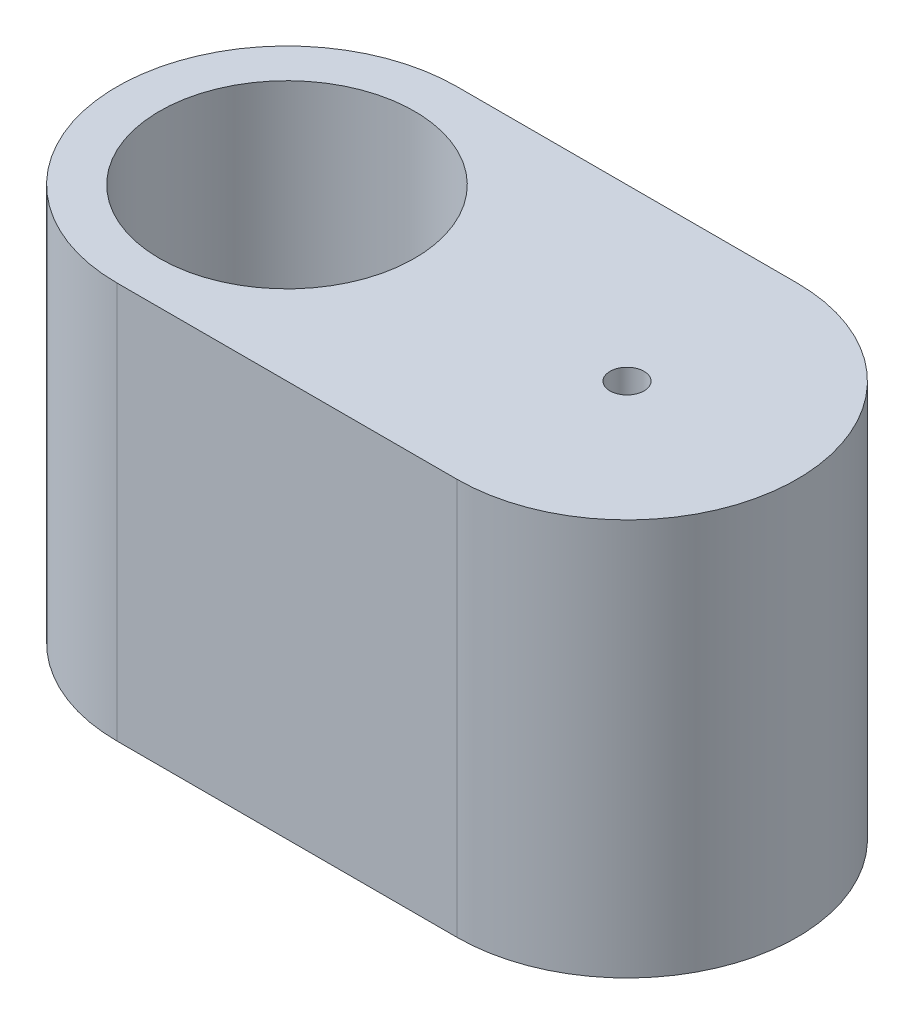
ISO-10303-21;
HEADER;
FILE_DESCRIPTION(('STEP AP214'),'2;1');
FILE_NAME('part.step','',(''),(''),'','','');
FILE_SCHEMA(('AUTOMOTIVE_DESIGN { 1 0 10303 214 1 1 1 1 }'));
ENDSEC;
DATA;
#1=APPLICATION_CONTEXT('core data for automotive mechanical design processes');
#2=APPLICATION_PROTOCOL_DEFINITION('international standard','automotive_design',2000,#1);
#3=PRODUCT_CONTEXT('',#1,'mechanical');
#4=PRODUCT('Part','Part','',(#3));
#5=PRODUCT_RELATED_PRODUCT_CATEGORY('part','',(#4));
#6=PRODUCT_DEFINITION_FORMATION('','',#4);
#7=PRODUCT_DEFINITION_CONTEXT('part definition',#1,'design');
#8=PRODUCT_DEFINITION('design','',#6,#7);
#9=PRODUCT_DEFINITION_SHAPE('','',#8);
#10=(LENGTH_UNIT() NAMED_UNIT(*) SI_UNIT(.MILLI.,.METRE.));
#11=(NAMED_UNIT(*) PLANE_ANGLE_UNIT() SI_UNIT($,.RADIAN.));
#12=(NAMED_UNIT(*) SI_UNIT($,.STERADIAN.) SOLID_ANGLE_UNIT());
#13=UNCERTAINTY_MEASURE_WITH_UNIT(LENGTH_MEASURE(1.E-05),#10,'distance_accuracy_value','');
#14=(GEOMETRIC_REPRESENTATION_CONTEXT(3) GLOBAL_UNCERTAINTY_ASSIGNED_CONTEXT((#13)) GLOBAL_UNIT_ASSIGNED_CONTEXT((#10,
#11,#12)) REPRESENTATION_CONTEXT('',''));
#15=CARTESIAN_POINT('',(0.,0.,0.));
#16=DIRECTION('',(0.,0.,1.));
#17=DIRECTION('',(1.,0.,0.));
#18=AXIS2_PLACEMENT_3D('',#15,#16,#17);
#19=CARTESIAN_POINT('',(0.,70.,0.));
#20=DIRECTION('',(0.,1.,0.));
#21=DIRECTION('',(0.,0.,1.));
#22=AXIS2_PLACEMENT_3D('',#19,#20,#21);
#23=PLANE('',#22);
#24=CARTESIAN_POINT('',(60.,70.,0.));
#25=DIRECTION('',(0.,1.,0.));
#26=DIRECTION('',(0.,0.,1.));
#27=AXIS2_PLACEMENT_3D('',#24,#25,#26);
#28=CIRCLE('',#27,3.00000000000001);
#29=CARTESIAN_POINT('',(60.,70.,3.00000000000001));
#30=VERTEX_POINT('',#29);
#31=EDGE_CURVE('E146',#30,#30,#28,.T.);
#32=ORIENTED_EDGE('',*,*,#31,.F.);
#33=EDGE_LOOP('',(#32));
#34=FACE_BOUND('',#33,.T.);
#35=CARTESIAN_POINT('',(0.,70.,0.));
#36=DIRECTION('',(0.,1.,0.));
#37=DIRECTION('',(0.,0.,1.));
#38=AXIS2_PLACEMENT_3D('',#35,#36,#37);
#39=CIRCLE('',#38,30.);
#40=CARTESIAN_POINT('',(0.,70.,-30.));
#41=VERTEX_POINT('',#40);
#42=CARTESIAN_POINT('',(0.,70.,30.));
#43=VERTEX_POINT('',#42);
#44=EDGE_CURVE('E92',#41,#43,#39,.T.);
#45=ORIENTED_EDGE('',*,*,#44,.T.);
#46=DIRECTION('',(1.,0.,0.));
#47=VECTOR('',#46,1.);
#48=CARTESIAN_POINT('',(0.,70.,30.));
#49=LINE('',#48,#47);
#50=CARTESIAN_POINT('',(60.,70.,30.));
#51=VERTEX_POINT('',#50);
#52=EDGE_CURVE('E87',#43,#51,#49,.T.);
#53=ORIENTED_EDGE('',*,*,#52,.T.);
#54=CARTESIAN_POINT('',(60.,70.,0.));
#55=DIRECTION('',(0.,1.,0.));
#56=DIRECTION('',(0.,0.,1.));
#57=AXIS2_PLACEMENT_3D('',#54,#55,#56);
#58=CIRCLE('',#57,30.);
#59=CARTESIAN_POINT('',(60.,70.,-30.));
#60=VERTEX_POINT('',#59);
#61=EDGE_CURVE('E90',#51,#60,#58,.T.);
#62=ORIENTED_EDGE('',*,*,#61,.T.);
#63=DIRECTION('',(-1.,0.,0.));
#64=VECTOR('',#63,1.);
#65=CARTESIAN_POINT('',(0.,70.,-30.));
#66=LINE('',#65,#64);
#67=EDGE_CURVE('E57',#60,#41,#66,.T.);
#68=ORIENTED_EDGE('',*,*,#67,.T.);
#69=EDGE_LOOP('',(#45,#53,#62,#68));
#70=FACE_BOUND('',#69,.T.);
#71=CARTESIAN_POINT('',(0.,70.,0.));
#72=DIRECTION('',(0.,1.,0.));
#73=DIRECTION('',(0.,0.,1.));
#74=AXIS2_PLACEMENT_3D('',#71,#72,#73);
#75=CIRCLE('',#74,22.5);
#76=CARTESIAN_POINT('',(0.,70.,22.5));
#77=VERTEX_POINT('',#76);
#78=EDGE_CURVE('E113',#77,#77,#75,.T.);
#79=ORIENTED_EDGE('',*,*,#78,.F.);
#80=EDGE_LOOP('',(#79));
#81=FACE_BOUND('',#80,.T.);
#82=ADVANCED_FACE('F38',(#34,#70,#81),#23,.T.);
#83=CARTESIAN_POINT('',(0.,0.,0.));
#84=DIRECTION('',(0.,1.,0.));
#85=DIRECTION('',(0.,0.,1.));
#86=AXIS2_PLACEMENT_3D('',#83,#84,#85);
#87=PLANE('',#86);
#88=CARTESIAN_POINT('',(59.9999999999999,0.,0.));
#89=DIRECTION('',(0.,-1.,0.));
#90=DIRECTION('',(0.,0.,-1.));
#91=AXIS2_PLACEMENT_3D('',#88,#89,#90);
#92=CIRCLE('',#91,6.);
#93=CARTESIAN_POINT('',(59.9999999999999,0.,-6.));
#94=VERTEX_POINT('',#93);
#95=EDGE_CURVE('E139',#94,#94,#92,.T.);
#96=ORIENTED_EDGE('',*,*,#95,.F.);
#97=EDGE_LOOP('',(#96));
#98=FACE_BOUND('',#97,.T.);
#99=CARTESIAN_POINT('',(0.,0.,0.));
#100=DIRECTION('',(0.,1.,0.));
#101=DIRECTION('',(0.,0.,1.));
#102=AXIS2_PLACEMENT_3D('',#99,#100,#101);
#103=CIRCLE('',#102,30.);
#104=CARTESIAN_POINT('',(0.,0.,-30.));
#105=VERTEX_POINT('',#104);
#106=CARTESIAN_POINT('',(0.,0.,30.));
#107=VERTEX_POINT('',#106);
#108=EDGE_CURVE('E109',#105,#107,#103,.T.);
#109=ORIENTED_EDGE('',*,*,#108,.F.);
#110=DIRECTION('',(-1.,0.,0.));
#111=VECTOR('',#110,1.);
#112=CARTESIAN_POINT('',(0.,0.,-30.));
#113=LINE('',#112,#111);
#114=CARTESIAN_POINT('',(60.,0.,-30.));
#115=VERTEX_POINT('',#114);
#116=EDGE_CURVE('E80',#115,#105,#113,.T.);
#117=ORIENTED_EDGE('',*,*,#116,.F.);
#118=CARTESIAN_POINT('',(60.,0.,0.));
#119=DIRECTION('',(0.,1.,0.));
#120=DIRECTION('',(0.,0.,1.));
#121=AXIS2_PLACEMENT_3D('',#118,#119,#120);
#122=CIRCLE('',#121,30.);
#123=CARTESIAN_POINT('',(60.,0.,30.));
#124=VERTEX_POINT('',#123);
#125=EDGE_CURVE('E74',#124,#115,#122,.T.);
#126=ORIENTED_EDGE('',*,*,#125,.F.);
#127=DIRECTION('',(1.,0.,0.));
#128=VECTOR('',#127,1.);
#129=CARTESIAN_POINT('',(0.,0.,30.));
#130=LINE('',#129,#128);
#131=EDGE_CURVE('E97',#107,#124,#130,.T.);
#132=ORIENTED_EDGE('',*,*,#131,.F.);
#133=EDGE_LOOP('',(#109,#117,#126,#132));
#134=FACE_BOUND('',#133,.T.);
#135=CARTESIAN_POINT('',(0.,0.,0.));
#136=DIRECTION('',(0.,1.,0.));
#137=DIRECTION('',(0.,0.,1.));
#138=AXIS2_PLACEMENT_3D('',#135,#136,#137);
#139=CIRCLE('',#138,22.5);
#140=CARTESIAN_POINT('',(0.,0.,22.5));
#141=VERTEX_POINT('',#140);
#142=EDGE_CURVE('E131',#141,#141,#139,.T.);
#143=ORIENTED_EDGE('',*,*,#142,.T.);
#144=EDGE_LOOP('',(#143));
#145=FACE_BOUND('',#144,.T.);
#146=ADVANCED_FACE('F126',(#98,#134,#145),#87,.F.);
#147=CARTESIAN_POINT('',(0.,70.,0.));
#148=DIRECTION('',(0.,-1.,0.));
#149=DIRECTION('',(0.,0.,-1.));
#150=AXIS2_PLACEMENT_3D('',#147,#148,#149);
#151=CYLINDRICAL_SURFACE('',#150,30.);
#152=ORIENTED_EDGE('',*,*,#108,.T.);
#153=DIRECTION('',(0.,-1.,0.));
#154=VECTOR('',#153,1.);
#155=CARTESIAN_POINT('',(0.,70.,30.));
#156=LINE('',#155,#154);
#157=EDGE_CURVE('E11',#43,#107,#156,.T.);
#158=ORIENTED_EDGE('',*,*,#157,.F.);
#159=ORIENTED_EDGE('',*,*,#44,.F.);
#160=DIRECTION('',(0.,-1.,0.));
#161=VECTOR('',#160,1.);
#162=CARTESIAN_POINT('',(0.,70.,-30.));
#163=LINE('',#162,#161);
#164=EDGE_CURVE('E105',#41,#105,#163,.T.);
#165=ORIENTED_EDGE('',*,*,#164,.T.);
#166=EDGE_LOOP('',(#152,#158,#159,#165));
#167=FACE_BOUND('',#166,.T.);
#168=ADVANCED_FACE('F40',(#167),#151,.T.);
#169=CARTESIAN_POINT('',(0.,70.,30.));
#170=DIRECTION('',(0.,0.,-1.));
#171=DIRECTION('',(-1.,0.,0.));
#172=AXIS2_PLACEMENT_3D('',#169,#170,#171);
#173=PLANE('',#172);
#174=ORIENTED_EDGE('',*,*,#131,.T.);
#175=DIRECTION('',(0.,-1.,0.));
#176=VECTOR('',#175,1.);
#177=CARTESIAN_POINT('',(60.,70.,30.));
#178=LINE('',#177,#176);
#179=EDGE_CURVE('E49',#51,#124,#178,.T.);
#180=ORIENTED_EDGE('',*,*,#179,.F.);
#181=ORIENTED_EDGE('',*,*,#52,.F.);
#182=ORIENTED_EDGE('',*,*,#157,.T.);
#183=EDGE_LOOP('',(#174,#180,#181,#182));
#184=FACE_BOUND('',#183,.T.);
#185=ADVANCED_FACE('F96',(#184),#173,.F.);
#186=CARTESIAN_POINT('',(60.,70.,0.));
#187=DIRECTION('',(0.,-1.,0.));
#188=DIRECTION('',(0.,0.,-1.));
#189=AXIS2_PLACEMENT_3D('',#186,#187,#188);
#190=CYLINDRICAL_SURFACE('',#189,30.);
#191=ORIENTED_EDGE('',*,*,#125,.T.);
#192=DIRECTION('',(0.,-1.,0.));
#193=VECTOR('',#192,1.);
#194=CARTESIAN_POINT('',(60.,70.,-30.));
#195=LINE('',#194,#193);
#196=EDGE_CURVE('E99',#60,#115,#195,.T.);
#197=ORIENTED_EDGE('',*,*,#196,.F.);
#198=ORIENTED_EDGE('',*,*,#61,.F.);
#199=ORIENTED_EDGE('',*,*,#179,.T.);
#200=EDGE_LOOP('',(#191,#197,#198,#199));
#201=FACE_BOUND('',#200,.T.);
#202=ADVANCED_FACE('F101',(#201),#190,.T.);
#203=CARTESIAN_POINT('',(0.,70.,-30.));
#204=DIRECTION('',(0.,0.,1.));
#205=DIRECTION('',(1.,0.,0.));
#206=AXIS2_PLACEMENT_3D('',#203,#204,#205);
#207=PLANE('',#206);
#208=ORIENTED_EDGE('',*,*,#116,.T.);
#209=ORIENTED_EDGE('',*,*,#164,.F.);
#210=ORIENTED_EDGE('',*,*,#67,.F.);
#211=ORIENTED_EDGE('',*,*,#196,.T.);
#212=EDGE_LOOP('',(#208,#209,#210,#211));
#213=FACE_BOUND('',#212,.T.);
#214=ADVANCED_FACE('F123',(#213),#207,.F.);
#215=CARTESIAN_POINT('',(0.,70.,0.));
#216=DIRECTION('',(0.,-1.,0.));
#217=DIRECTION('',(0.,0.,-1.));
#218=AXIS2_PLACEMENT_3D('',#215,#216,#217);
#219=CYLINDRICAL_SURFACE('',#218,22.5);
#220=ORIENTED_EDGE('',*,*,#78,.T.);
#221=EDGE_LOOP('',(#220));
#222=FACE_BOUND('',#221,.T.);
#223=ORIENTED_EDGE('',*,*,#142,.F.);
#224=EDGE_LOOP('',(#223));
#225=FACE_BOUND('',#224,.T.);
#226=ADVANCED_FACE('F166',(#222,#225),#219,.F.);
#227=CARTESIAN_POINT('',(59.9999999999999,2.5,0.));
#228=DIRECTION('',(0.,-1.,0.));
#229=DIRECTION('',(0.,0.,-1.));
#230=AXIS2_PLACEMENT_3D('',#227,#228,#229);
#231=CYLINDRICAL_SURFACE('',#230,6.);
#232=CARTESIAN_POINT('',(59.9999999999999,2.5,0.));
#233=DIRECTION('',(0.,-1.,0.));
#234=DIRECTION('',(0.,0.,-1.));
#235=AXIS2_PLACEMENT_3D('',#232,#233,#234);
#236=CIRCLE('',#235,6.);
#237=CARTESIAN_POINT('',(59.9999999999999,2.5,-6.));
#238=VERTEX_POINT('',#237);
#239=EDGE_CURVE('E135',#238,#238,#236,.T.);
#240=ORIENTED_EDGE('',*,*,#239,.F.);
#241=EDGE_LOOP('',(#240));
#242=FACE_BOUND('',#241,.T.);
#243=ORIENTED_EDGE('',*,*,#95,.T.);
#244=EDGE_LOOP('',(#243));
#245=FACE_BOUND('',#244,.T.);
#246=ADVANCED_FACE('F160',(#242,#245),#231,.F.);
#247=CARTESIAN_POINT('',(59.9999999999999,2.5,0.));
#248=DIRECTION('',(0.,-1.,0.));
#249=DIRECTION('',(0.,0.,-1.));
#250=AXIS2_PLACEMENT_3D('',#247,#248,#249);
#251=PLANE('',#250);
#252=CARTESIAN_POINT('',(59.9999999999999,2.5,0.));
#253=DIRECTION('',(0.,-1.,0.));
#254=DIRECTION('',(0.,0.,-1.));
#255=AXIS2_PLACEMENT_3D('',#252,#253,#254);
#256=CIRCLE('',#255,3.00000000000001);
#257=CARTESIAN_POINT('',(59.9999999999999,2.5,-3.));
#258=VERTEX_POINT('',#257);
#259=EDGE_CURVE('E42',#258,#258,#256,.T.);
#260=ORIENTED_EDGE('',*,*,#259,.F.);
#261=EDGE_LOOP('',(#260));
#262=FACE_BOUND('',#261,.T.);
#263=ORIENTED_EDGE('',*,*,#239,.T.);
#264=EDGE_LOOP('',(#263));
#265=FACE_BOUND('',#264,.T.);
#266=ADVANCED_FACE('F157',(#262,#265),#251,.T.);
#267=CARTESIAN_POINT('',(59.9999999999999,6.,0.));
#268=DIRECTION('',(0.,-1.,0.));
#269=DIRECTION('',(0.,0.,-1.));
#270=AXIS2_PLACEMENT_3D('',#267,#268,#269);
#271=CYLINDRICAL_SURFACE('',#270,3.00000000000001);
#272=ORIENTED_EDGE('',*,*,#259,.T.);
#273=EDGE_LOOP('',(#272));
#274=FACE_BOUND('',#273,.T.);
#275=ORIENTED_EDGE('',*,*,#31,.T.);
#276=EDGE_LOOP('',(#275));
#277=FACE_BOUND('',#276,.T.);
#278=ADVANCED_FACE('F155',(#274,#277),#271,.F.);
#279=CLOSED_SHELL('',(#82,#146,#168,#185,#202,#214,#226,#246,#266,#278));
#280=MANIFOLD_SOLID_BREP('B2',#279);
#281=ADVANCED_BREP_SHAPE_REPRESENTATION('',(#18,#280),#14);
#282=SHAPE_DEFINITION_REPRESENTATION(#9,#281);
ENDSEC;
END-ISO-10303-21;
